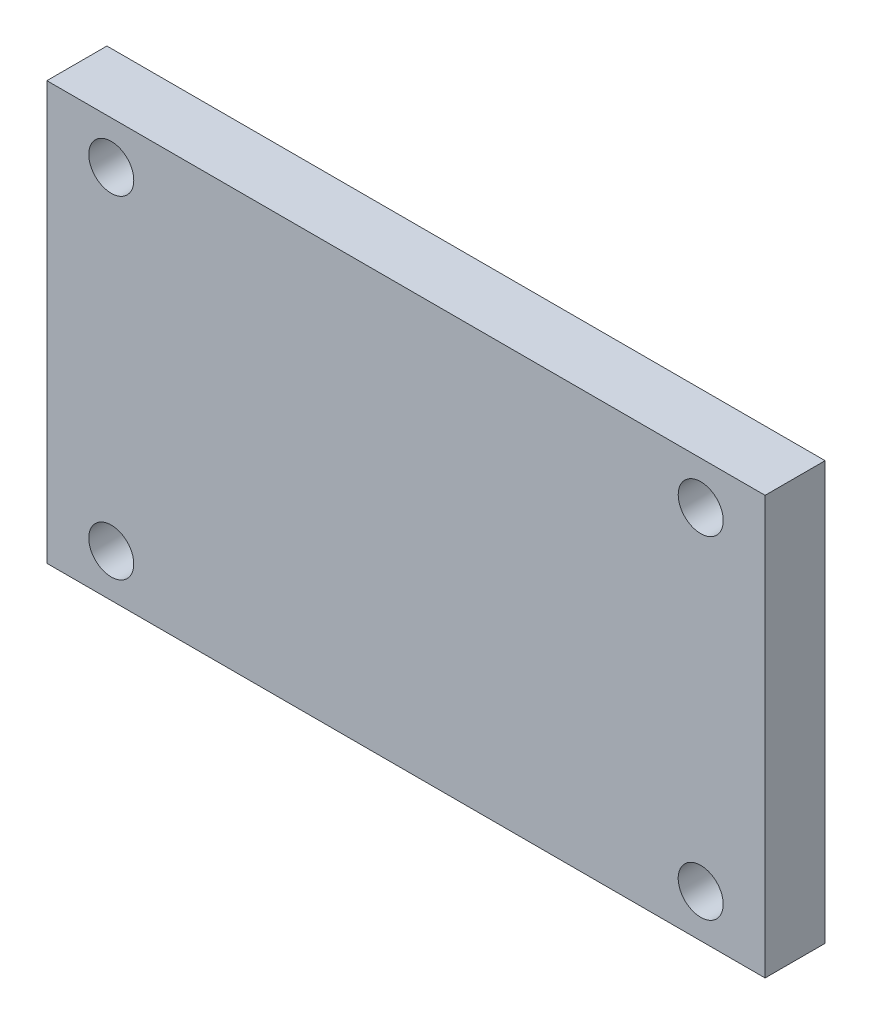
ISO-10303-21;
HEADER;
FILE_DESCRIPTION(('STEP AP214'),'2;1');
FILE_NAME('part.step','',(''),(''),'','','');
FILE_SCHEMA(('AUTOMOTIVE_DESIGN { 1 0 10303 214 1 1 1 1 }'));
ENDSEC;
DATA;
#1=APPLICATION_CONTEXT('core data for automotive mechanical design processes');
#2=APPLICATION_PROTOCOL_DEFINITION('international standard','automotive_design',2000,#1);
#3=PRODUCT_CONTEXT('',#1,'mechanical');
#4=PRODUCT('Part','Part','',(#3));
#5=PRODUCT_RELATED_PRODUCT_CATEGORY('part','',(#4));
#6=PRODUCT_DEFINITION_FORMATION('','',#4);
#7=PRODUCT_DEFINITION_CONTEXT('part definition',#1,'design');
#8=PRODUCT_DEFINITION('design','',#6,#7);
#9=PRODUCT_DEFINITION_SHAPE('','',#8);
#10=(LENGTH_UNIT() NAMED_UNIT(*) SI_UNIT(.MILLI.,.METRE.));
#11=(NAMED_UNIT(*) PLANE_ANGLE_UNIT() SI_UNIT($,.RADIAN.));
#12=(NAMED_UNIT(*) SI_UNIT($,.STERADIAN.) SOLID_ANGLE_UNIT());
#13=UNCERTAINTY_MEASURE_WITH_UNIT(LENGTH_MEASURE(1.E-05),#10,'distance_accuracy_value','');
#14=(GEOMETRIC_REPRESENTATION_CONTEXT(3) GLOBAL_UNCERTAINTY_ASSIGNED_CONTEXT((#13)) GLOBAL_UNIT_ASSIGNED_CONTEXT((#10,
#11,#12)) REPRESENTATION_CONTEXT('',''));
#15=CARTESIAN_POINT('',(0.,0.,0.));
#16=DIRECTION('',(0.,0.,1.));
#17=DIRECTION('',(1.,0.,0.));
#18=AXIS2_PLACEMENT_3D('',#15,#16,#17);
#19=CARTESIAN_POINT('',(0.,0.,2.8));
#20=DIRECTION('',(0.,0.,1.));
#21=DIRECTION('',(1.,0.,0.));
#22=AXIS2_PLACEMENT_3D('',#19,#20,#21);
#23=PLANE('',#22);
#24=CARTESIAN_POINT('',(30.5,-17.5,2.8));
#25=DIRECTION('',(0.,0.,1.));
#26=DIRECTION('',(1.,0.,0.));
#27=AXIS2_PLACEMENT_3D('',#24,#25,#26);
#28=CIRCLE('',#27,1.05);
#29=CARTESIAN_POINT('',(31.55,-17.5,2.8));
#30=VERTEX_POINT('',#29);
#31=EDGE_CURVE('E124',#30,#30,#28,.T.);
#32=ORIENTED_EDGE('',*,*,#31,.F.);
#33=EDGE_LOOP('',(#32));
#34=FACE_BOUND('',#33,.T.);
#35=CARTESIAN_POINT('',(3.003,-2.,2.8));
#36=DIRECTION('',(0.,0.,1.));
#37=DIRECTION('',(1.,0.,0.));
#38=AXIS2_PLACEMENT_3D('',#35,#36,#37);
#39=CIRCLE('',#38,1.05);
#40=CARTESIAN_POINT('',(4.053,-2.,2.8));
#41=VERTEX_POINT('',#40);
#42=EDGE_CURVE('E103',#41,#41,#39,.T.);
#43=ORIENTED_EDGE('',*,*,#42,.F.);
#44=EDGE_LOOP('',(#43));
#45=FACE_BOUND('',#44,.T.);
#46=DIRECTION('',(0.,-1.,0.));
#47=VECTOR('',#46,1.);
#48=CARTESIAN_POINT('',(0.,0.,2.8));
#49=LINE('',#48,#47);
#50=CARTESIAN_POINT('',(0.,0.,2.8));
#51=VERTEX_POINT('',#50);
#52=CARTESIAN_POINT('',(0.,-19.5,2.8));
#53=VERTEX_POINT('',#52);
#54=EDGE_CURVE('E88',#51,#53,#49,.T.);
#55=ORIENTED_EDGE('',*,*,#54,.T.);
#56=DIRECTION('',(1.,0.,0.));
#57=VECTOR('',#56,1.);
#58=CARTESIAN_POINT('',(0.,-19.5,2.8));
#59=LINE('',#58,#57);
#60=CARTESIAN_POINT('',(33.503,-19.5,2.8));
#61=VERTEX_POINT('',#60);
#62=EDGE_CURVE('E83',#53,#61,#59,.T.);
#63=ORIENTED_EDGE('',*,*,#62,.T.);
#64=DIRECTION('',(0.,1.,0.));
#65=VECTOR('',#64,1.);
#66=CARTESIAN_POINT('',(33.503,0.,2.8));
#67=LINE('',#66,#65);
#68=CARTESIAN_POINT('',(33.503,0.,2.8));
#69=VERTEX_POINT('',#68);
#70=EDGE_CURVE('E86',#61,#69,#67,.T.);
#71=ORIENTED_EDGE('',*,*,#70,.T.);
#72=DIRECTION('',(-1.,0.,0.));
#73=VECTOR('',#72,1.);
#74=CARTESIAN_POINT('',(0.,0.,2.8));
#75=LINE('',#74,#73);
#76=EDGE_CURVE('E53',#69,#51,#75,.T.);
#77=ORIENTED_EDGE('',*,*,#76,.T.);
#78=EDGE_LOOP('',(#55,#63,#71,#77));
#79=FACE_BOUND('',#78,.T.);
#80=CARTESIAN_POINT('',(3.003,-17.5,2.8));
#81=DIRECTION('',(0.,0.,1.));
#82=DIRECTION('',(-1.,0.,0.));
#83=AXIS2_PLACEMENT_3D('',#80,#81,#82);
#84=CIRCLE('',#83,1.05);
#85=CARTESIAN_POINT('',(1.953,-17.5,2.8));
#86=VERTEX_POINT('',#85);
#87=EDGE_CURVE('E118',#86,#86,#84,.T.);
#88=ORIENTED_EDGE('',*,*,#87,.F.);
#89=EDGE_LOOP('',(#88));
#90=FACE_BOUND('',#89,.T.);
#91=CARTESIAN_POINT('',(30.5,-1.99999999999999,2.8));
#92=DIRECTION('',(0.,0.,1.));
#93=DIRECTION('',(-1.,0.,0.));
#94=AXIS2_PLACEMENT_3D('',#91,#92,#93);
#95=CIRCLE('',#94,1.05);
#96=CARTESIAN_POINT('',(29.45,-1.99999999999999,2.8));
#97=VERTEX_POINT('',#96);
#98=EDGE_CURVE('E130',#97,#97,#95,.T.);
#99=ORIENTED_EDGE('',*,*,#98,.F.);
#100=EDGE_LOOP('',(#99));
#101=FACE_BOUND('',#100,.T.);
#102=ADVANCED_FACE('F36',(#34,#45,#79,#90,#101),#23,.T.);
#103=CARTESIAN_POINT('',(0.,0.,0.));
#104=DIRECTION('',(0.,0.,1.));
#105=DIRECTION('',(1.,0.,0.));
#106=AXIS2_PLACEMENT_3D('',#103,#104,#105);
#107=PLANE('',#106);
#108=DIRECTION('',(0.,-1.,0.));
#109=VECTOR('',#108,1.);
#110=CARTESIAN_POINT('',(0.,0.,0.));
#111=LINE('',#110,#109);
#112=CARTESIAN_POINT('',(0.,0.,0.));
#113=VERTEX_POINT('',#112);
#114=CARTESIAN_POINT('',(0.,-19.5,0.));
#115=VERTEX_POINT('',#114);
#116=EDGE_CURVE('E100',#113,#115,#111,.T.);
#117=ORIENTED_EDGE('',*,*,#116,.F.);
#118=DIRECTION('',(-1.,0.,0.));
#119=VECTOR('',#118,1.);
#120=CARTESIAN_POINT('',(0.,0.,0.));
#121=LINE('',#120,#119);
#122=CARTESIAN_POINT('',(33.503,0.,0.));
#123=VERTEX_POINT('',#122);
#124=EDGE_CURVE('E76',#123,#113,#121,.T.);
#125=ORIENTED_EDGE('',*,*,#124,.F.);
#126=DIRECTION('',(0.,1.,0.));
#127=VECTOR('',#126,1.);
#128=CARTESIAN_POINT('',(33.503,0.,0.));
#129=LINE('',#128,#127);
#130=CARTESIAN_POINT('',(33.503,-19.5,0.));
#131=VERTEX_POINT('',#130);
#132=EDGE_CURVE('E70',#131,#123,#129,.T.);
#133=ORIENTED_EDGE('',*,*,#132,.F.);
#134=DIRECTION('',(1.,0.,0.));
#135=VECTOR('',#134,1.);
#136=CARTESIAN_POINT('',(0.,-19.5,0.));
#137=LINE('',#136,#135);
#138=EDGE_CURVE('E92',#115,#131,#137,.T.);
#139=ORIENTED_EDGE('',*,*,#138,.F.);
#140=EDGE_LOOP('',(#117,#125,#133,#139));
#141=FACE_BOUND('',#140,.T.);
#142=CARTESIAN_POINT('',(3.003,-2.,0.));
#143=DIRECTION('',(0.,0.,1.));
#144=DIRECTION('',(1.,0.,0.));
#145=AXIS2_PLACEMENT_3D('',#142,#143,#144);
#146=CIRCLE('',#145,1.05);
#147=CARTESIAN_POINT('',(4.053,-2.,0.));
#148=VERTEX_POINT('',#147);
#149=EDGE_CURVE('E115',#148,#148,#146,.T.);
#150=ORIENTED_EDGE('',*,*,#149,.T.);
#151=EDGE_LOOP('',(#150));
#152=FACE_BOUND('',#151,.T.);
#153=CARTESIAN_POINT('',(3.003,-17.5,0.));
#154=DIRECTION('',(0.,0.,1.));
#155=DIRECTION('',(-1.,0.,0.));
#156=AXIS2_PLACEMENT_3D('',#153,#154,#155);
#157=CIRCLE('',#156,1.05);
#158=CARTESIAN_POINT('',(1.953,-17.5,0.));
#159=VERTEX_POINT('',#158);
#160=EDGE_CURVE('E121',#159,#159,#157,.T.);
#161=ORIENTED_EDGE('',*,*,#160,.T.);
#162=EDGE_LOOP('',(#161));
#163=FACE_BOUND('',#162,.T.);
#164=CARTESIAN_POINT('',(30.5,-17.5,0.));
#165=DIRECTION('',(0.,0.,1.));
#166=DIRECTION('',(1.,0.,0.));
#167=AXIS2_PLACEMENT_3D('',#164,#165,#166);
#168=CIRCLE('',#167,1.05);
#169=CARTESIAN_POINT('',(31.55,-17.5,0.));
#170=VERTEX_POINT('',#169);
#171=EDGE_CURVE('E127',#170,#170,#168,.T.);
#172=ORIENTED_EDGE('',*,*,#171,.T.);
#173=EDGE_LOOP('',(#172));
#174=FACE_BOUND('',#173,.T.);
#175=CARTESIAN_POINT('',(30.5,-1.99999999999999,0.));
#176=DIRECTION('',(0.,0.,1.));
#177=DIRECTION('',(-1.,0.,0.));
#178=AXIS2_PLACEMENT_3D('',#175,#176,#177);
#179=CIRCLE('',#178,1.05);
#180=CARTESIAN_POINT('',(29.45,-1.99999999999999,0.));
#181=VERTEX_POINT('',#180);
#182=EDGE_CURVE('E133',#181,#181,#179,.T.);
#183=ORIENTED_EDGE('',*,*,#182,.T.);
#184=EDGE_LOOP('',(#183));
#185=FACE_BOUND('',#184,.T.);
#186=ADVANCED_FACE('F111',(#141,#152,#163,#174,#185),#107,.F.);
#187=CARTESIAN_POINT('',(0.,0.,2.8));
#188=DIRECTION('',(1.,0.,0.));
#189=DIRECTION('',(0.,1.,0.));
#190=AXIS2_PLACEMENT_3D('',#187,#188,#189);
#191=PLANE('',#190);
#192=ORIENTED_EDGE('',*,*,#116,.T.);
#193=DIRECTION('',(0.,0.,-1.));
#194=VECTOR('',#193,1.);
#195=CARTESIAN_POINT('',(0.,-19.5,2.8));
#196=LINE('',#195,#194);
#197=EDGE_CURVE('E11',#53,#115,#196,.T.);
#198=ORIENTED_EDGE('',*,*,#197,.F.);
#199=ORIENTED_EDGE('',*,*,#54,.F.);
#200=DIRECTION('',(0.,0.,-1.));
#201=VECTOR('',#200,1.);
#202=CARTESIAN_POINT('',(0.,0.,2.8));
#203=LINE('',#202,#201);
#204=EDGE_CURVE('E96',#51,#113,#203,.T.);
#205=ORIENTED_EDGE('',*,*,#204,.T.);
#206=EDGE_LOOP('',(#192,#198,#199,#205));
#207=FACE_BOUND('',#206,.T.);
#208=ADVANCED_FACE('F38',(#207),#191,.F.);
#209=CARTESIAN_POINT('',(0.,-19.5,2.8));
#210=DIRECTION('',(0.,1.,0.));
#211=DIRECTION('',(0.,0.,1.));
#212=AXIS2_PLACEMENT_3D('',#209,#210,#211);
#213=PLANE('',#212);
#214=ORIENTED_EDGE('',*,*,#138,.T.);
#215=DIRECTION('',(0.,0.,-1.));
#216=VECTOR('',#215,1.);
#217=CARTESIAN_POINT('',(33.503,-19.5,2.8));
#218=LINE('',#217,#216);
#219=EDGE_CURVE('E45',#61,#131,#218,.T.);
#220=ORIENTED_EDGE('',*,*,#219,.F.);
#221=ORIENTED_EDGE('',*,*,#62,.F.);
#222=ORIENTED_EDGE('',*,*,#197,.T.);
#223=EDGE_LOOP('',(#214,#220,#221,#222));
#224=FACE_BOUND('',#223,.T.);
#225=ADVANCED_FACE('F91',(#224),#213,.F.);
#226=CARTESIAN_POINT('',(33.503,0.,2.8));
#227=DIRECTION('',(-1.,0.,0.));
#228=DIRECTION('',(0.,0.,1.));
#229=AXIS2_PLACEMENT_3D('',#226,#227,#228);
#230=PLANE('',#229);
#231=ORIENTED_EDGE('',*,*,#132,.T.);
#232=DIRECTION('',(0.,0.,-1.));
#233=VECTOR('',#232,1.);
#234=CARTESIAN_POINT('',(33.503,0.,2.8));
#235=LINE('',#234,#233);
#236=EDGE_CURVE('E93',#69,#123,#235,.T.);
#237=ORIENTED_EDGE('',*,*,#236,.F.);
#238=ORIENTED_EDGE('',*,*,#70,.F.);
#239=ORIENTED_EDGE('',*,*,#219,.T.);
#240=EDGE_LOOP('',(#231,#237,#238,#239));
#241=FACE_BOUND('',#240,.T.);
#242=ADVANCED_FACE('F94',(#241),#230,.F.);
#243=CARTESIAN_POINT('',(0.,0.,2.8));
#244=DIRECTION('',(0.,-1.,0.));
#245=DIRECTION('',(0.,0.,-1.));
#246=AXIS2_PLACEMENT_3D('',#243,#244,#245);
#247=PLANE('',#246);
#248=ORIENTED_EDGE('',*,*,#124,.T.);
#249=ORIENTED_EDGE('',*,*,#204,.F.);
#250=ORIENTED_EDGE('',*,*,#76,.F.);
#251=ORIENTED_EDGE('',*,*,#236,.T.);
#252=EDGE_LOOP('',(#248,#249,#250,#251));
#253=FACE_BOUND('',#252,.T.);
#254=ADVANCED_FACE('F108',(#253),#247,.F.);
#255=CARTESIAN_POINT('',(3.003,-2.,2.8));
#256=DIRECTION('',(0.,0.,-1.));
#257=DIRECTION('',(-1.,0.,0.));
#258=AXIS2_PLACEMENT_3D('',#255,#256,#257);
#259=CYLINDRICAL_SURFACE('',#258,1.05);
#260=ORIENTED_EDGE('',*,*,#42,.T.);
#261=EDGE_LOOP('',(#260));
#262=FACE_BOUND('',#261,.T.);
#263=ORIENTED_EDGE('',*,*,#149,.F.);
#264=EDGE_LOOP('',(#263));
#265=FACE_BOUND('',#264,.T.);
#266=ADVANCED_FACE('F152',(#262,#265),#259,.F.);
#267=CARTESIAN_POINT('',(3.003,-17.5,2.8));
#268=DIRECTION('',(0.,0.,-1.));
#269=DIRECTION('',(-1.,0.,0.));
#270=AXIS2_PLACEMENT_3D('',#267,#268,#269);
#271=CYLINDRICAL_SURFACE('',#270,1.05);
#272=ORIENTED_EDGE('',*,*,#87,.T.);
#273=EDGE_LOOP('',(#272));
#274=FACE_BOUND('',#273,.T.);
#275=ORIENTED_EDGE('',*,*,#160,.F.);
#276=EDGE_LOOP('',(#275));
#277=FACE_BOUND('',#276,.T.);
#278=ADVANCED_FACE('F198',(#274,#277),#271,.F.);
#279=CARTESIAN_POINT('',(30.5,-17.5,2.8));
#280=DIRECTION('',(0.,0.,-1.));
#281=DIRECTION('',(-1.,0.,0.));
#282=AXIS2_PLACEMENT_3D('',#279,#280,#281);
#283=CYLINDRICAL_SURFACE('',#282,1.05);
#284=ORIENTED_EDGE('',*,*,#31,.T.);
#285=EDGE_LOOP('',(#284));
#286=FACE_BOUND('',#285,.T.);
#287=ORIENTED_EDGE('',*,*,#171,.F.);
#288=EDGE_LOOP('',(#287));
#289=FACE_BOUND('',#288,.T.);
#290=ADVANCED_FACE('F206',(#286,#289),#283,.F.);
#291=CARTESIAN_POINT('',(30.5,-1.99999999999999,2.8));
#292=DIRECTION('',(0.,0.,-1.));
#293=DIRECTION('',(-1.,0.,0.));
#294=AXIS2_PLACEMENT_3D('',#291,#292,#293);
#295=CYLINDRICAL_SURFACE('',#294,1.05);
#296=ORIENTED_EDGE('',*,*,#98,.T.);
#297=EDGE_LOOP('',(#296));
#298=FACE_BOUND('',#297,.T.);
#299=ORIENTED_EDGE('',*,*,#182,.F.);
#300=EDGE_LOOP('',(#299));
#301=FACE_BOUND('',#300,.T.);
#302=ADVANCED_FACE('F139',(#298,#301),#295,.F.);
#303=CLOSED_SHELL('',(#102,#186,#208,#225,#242,#254,#266,#278,#290,#302));
#304=MANIFOLD_SOLID_BREP('B2',#303);
#305=ADVANCED_BREP_SHAPE_REPRESENTATION('',(#18,#304),#14);
#306=SHAPE_DEFINITION_REPRESENTATION(#9,#305);
ENDSEC;
END-ISO-10303-21;
